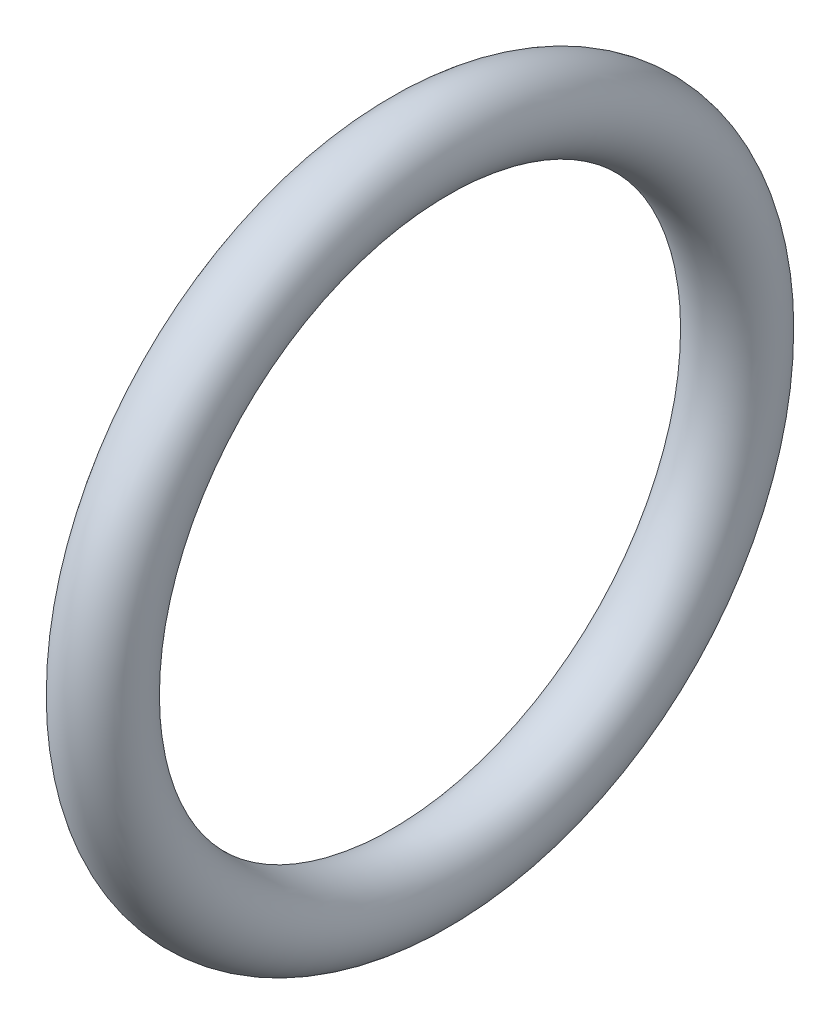
ISO-10303-21;
HEADER;
FILE_DESCRIPTION(('STEP AP214'),'2;1');
FILE_NAME('part.step','',(''),(''),'','','');
FILE_SCHEMA(('AUTOMOTIVE_DESIGN { 1 0 10303 214 1 1 1 1 }'));
ENDSEC;
DATA;
#1=APPLICATION_CONTEXT('core data for automotive mechanical design processes');
#2=APPLICATION_PROTOCOL_DEFINITION('international standard','automotive_design',2000,#1);
#3=PRODUCT_CONTEXT('',#1,'mechanical');
#4=PRODUCT('Part','Part','',(#3));
#5=PRODUCT_RELATED_PRODUCT_CATEGORY('part','',(#4));
#6=PRODUCT_DEFINITION_FORMATION('','',#4);
#7=PRODUCT_DEFINITION_CONTEXT('part definition',#1,'design');
#8=PRODUCT_DEFINITION('design','',#6,#7);
#9=PRODUCT_DEFINITION_SHAPE('','',#8);
#10=(LENGTH_UNIT() NAMED_UNIT(*) SI_UNIT(.MILLI.,.METRE.));
#11=(NAMED_UNIT(*) PLANE_ANGLE_UNIT() SI_UNIT($,.RADIAN.));
#12=(NAMED_UNIT(*) SI_UNIT($,.STERADIAN.) SOLID_ANGLE_UNIT());
#13=UNCERTAINTY_MEASURE_WITH_UNIT(LENGTH_MEASURE(1.E-05),#10,'distance_accuracy_value','');
#14=(GEOMETRIC_REPRESENTATION_CONTEXT(3) GLOBAL_UNCERTAINTY_ASSIGNED_CONTEXT((#13)) GLOBAL_UNIT_ASSIGNED_CONTEXT((#10,
#11,#12)) REPRESENTATION_CONTEXT('',''));
#15=CARTESIAN_POINT('',(0.,0.,0.));
#16=DIRECTION('',(0.,0.,1.));
#17=DIRECTION('',(1.,0.,0.));
#18=AXIS2_PLACEMENT_3D('',#15,#16,#17);
#19=CARTESIAN_POINT('',(0.,0.,0.));
#20=DIRECTION('',(1.,0.,0.));
#21=DIRECTION('',(0.,0.,-1.));
#22=AXIS2_PLACEMENT_3D('',#19,#20,#21);
#23=TOROIDAL_SURFACE('',#22,10.3,1.3);
#24=CARTESIAN_POINT('',(0.,0.,-11.6));
#25=VERTEX_POINT('',#24);
#26=VERTEX_LOOP('',#25);
#27=FACE_BOUND('',#26,.T.);
#28=ADVANCED_FACE('F33',(#27),#23,.T.);
#29=CLOSED_SHELL('',(#28));
#30=MANIFOLD_SOLID_BREP('B2',#29);
#31=ADVANCED_BREP_SHAPE_REPRESENTATION('',(#18,#30),#14);
#32=SHAPE_DEFINITION_REPRESENTATION(#9,#31);
ENDSEC;
END-ISO-10303-21;
